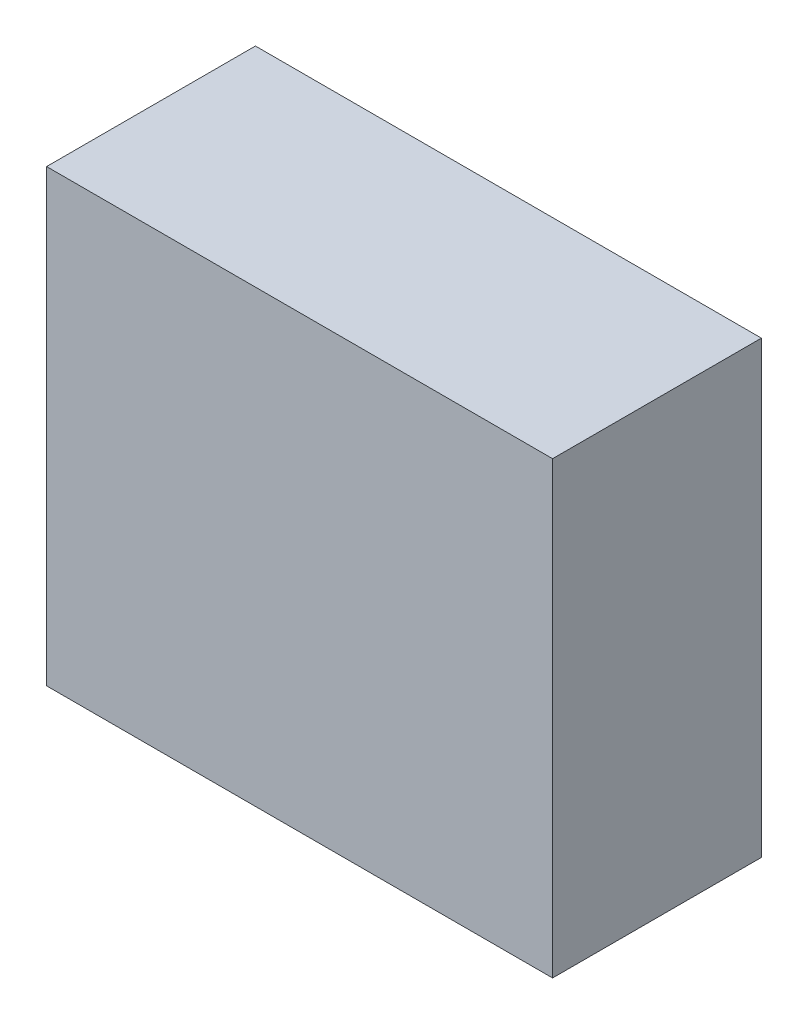
ISO-10303-21;
HEADER;
FILE_DESCRIPTION(('STEP AP214'),'2;1');
FILE_NAME('part.step','',(''),(''),'','','');
FILE_SCHEMA(('AUTOMOTIVE_DESIGN { 1 0 10303 214 1 1 1 1 }'));
ENDSEC;
DATA;
#1=APPLICATION_CONTEXT('core data for automotive mechanical design processes');
#2=APPLICATION_PROTOCOL_DEFINITION('international standard','automotive_design',2000,#1);
#3=PRODUCT_CONTEXT('',#1,'mechanical');
#4=PRODUCT('Part','Part','',(#3));
#5=PRODUCT_RELATED_PRODUCT_CATEGORY('part','',(#4));
#6=PRODUCT_DEFINITION_FORMATION('','',#4);
#7=PRODUCT_DEFINITION_CONTEXT('part definition',#1,'design');
#8=PRODUCT_DEFINITION('design','',#6,#7);
#9=PRODUCT_DEFINITION_SHAPE('','',#8);
#10=(LENGTH_UNIT() NAMED_UNIT(*) SI_UNIT(.MILLI.,.METRE.));
#11=(NAMED_UNIT(*) PLANE_ANGLE_UNIT() SI_UNIT($,.RADIAN.));
#12=(NAMED_UNIT(*) SI_UNIT($,.STERADIAN.) SOLID_ANGLE_UNIT());
#13=UNCERTAINTY_MEASURE_WITH_UNIT(LENGTH_MEASURE(1.E-05),#10,'distance_accuracy_value','');
#14=(GEOMETRIC_REPRESENTATION_CONTEXT(3) GLOBAL_UNCERTAINTY_ASSIGNED_CONTEXT((#13)) GLOBAL_UNIT_ASSIGNED_CONTEXT((#10,
#11,#12)) REPRESENTATION_CONTEXT('',''));
#15=CARTESIAN_POINT('',(0.,0.,0.));
#16=DIRECTION('',(0.,0.,1.));
#17=DIRECTION('',(1.,0.,0.));
#18=AXIS2_PLACEMENT_3D('',#15,#16,#17);
#19=CARTESIAN_POINT('',(-72.,-55.,236.5));
#20=DIRECTION('',(0.,0.,1.));
#21=DIRECTION('',(1.,0.,0.));
#22=AXIS2_PLACEMENT_3D('',#19,#20,#21);
#23=PLANE('',#22);
#24=DIRECTION('',(-1.,0.,0.));
#25=VECTOR('',#24,1.);
#26=CARTESIAN_POINT('',(-72.,-55.,236.5));
#27=LINE('',#26,#25);
#28=CARTESIAN_POINT('',(-72.,-55.,236.5));
#29=VERTEX_POINT('',#28);
#30=CARTESIAN_POINT('',(-198.,-55.,236.5));
#31=VERTEX_POINT('',#30);
#32=EDGE_CURVE('E70',#29,#31,#27,.T.);
#33=ORIENTED_EDGE('',*,*,#32,.F.);
#34=DIRECTION('',(0.,1.,0.));
#35=VECTOR('',#34,1.);
#36=CARTESIAN_POINT('',(-72.,-55.,236.5));
#37=LINE('',#36,#35);
#38=CARTESIAN_POINT('',(-72.,57.,236.5));
#39=VERTEX_POINT('',#38);
#40=EDGE_CURVE('E63',#29,#39,#37,.T.);
#41=ORIENTED_EDGE('',*,*,#40,.T.);
#42=DIRECTION('',(-1.,0.,0.));
#43=VECTOR('',#42,1.);
#44=CARTESIAN_POINT('',(-72.,57.,236.5));
#45=LINE('',#44,#43);
#46=CARTESIAN_POINT('',(-198.,57.,236.5));
#47=VERTEX_POINT('',#46);
#48=EDGE_CURVE('E72',#39,#47,#45,.T.);
#49=ORIENTED_EDGE('',*,*,#48,.T.);
#50=DIRECTION('',(0.,1.,0.));
#51=VECTOR('',#50,1.);
#52=CARTESIAN_POINT('',(-198.,-55.,236.5));
#53=LINE('',#52,#51);
#54=EDGE_CURVE('E10',#31,#47,#53,.T.);
#55=ORIENTED_EDGE('',*,*,#54,.F.);
#56=EDGE_LOOP('',(#33,#41,#49,#55));
#57=FACE_BOUND('',#56,.T.);
#58=ADVANCED_FACE('F15',(#57),#23,.T.);
#59=CARTESIAN_POINT('',(-72.,-55.,184.5));
#60=DIRECTION('',(0.,0.,1.));
#61=DIRECTION('',(1.,0.,0.));
#62=AXIS2_PLACEMENT_3D('',#59,#60,#61);
#63=PLANE('',#62);
#64=DIRECTION('',(0.,1.,0.));
#65=VECTOR('',#64,1.);
#66=CARTESIAN_POINT('',(-198.,-55.,184.5));
#67=LINE('',#66,#65);
#68=CARTESIAN_POINT('',(-198.,-55.,184.5));
#69=VERTEX_POINT('',#68);
#70=CARTESIAN_POINT('',(-198.,57.,184.5));
#71=VERTEX_POINT('',#70);
#72=EDGE_CURVE('E26',#69,#71,#67,.T.);
#73=ORIENTED_EDGE('',*,*,#72,.T.);
#74=DIRECTION('',(-1.,0.,0.));
#75=VECTOR('',#74,1.);
#76=CARTESIAN_POINT('',(-72.,57.,184.5));
#77=LINE('',#76,#75);
#78=CARTESIAN_POINT('',(-72.,57.,184.5));
#79=VERTEX_POINT('',#78);
#80=EDGE_CURVE('E88',#79,#71,#77,.T.);
#81=ORIENTED_EDGE('',*,*,#80,.F.);
#82=DIRECTION('',(0.,1.,0.));
#83=VECTOR('',#82,1.);
#84=CARTESIAN_POINT('',(-72.,-55.,184.5));
#85=LINE('',#84,#83);
#86=CARTESIAN_POINT('',(-72.,-55.,184.5));
#87=VERTEX_POINT('',#86);
#88=EDGE_CURVE('E94',#87,#79,#85,.T.);
#89=ORIENTED_EDGE('',*,*,#88,.F.);
#90=DIRECTION('',(-1.,0.,0.));
#91=VECTOR('',#90,1.);
#92=CARTESIAN_POINT('',(-72.,-55.,184.5));
#93=LINE('',#92,#91);
#94=EDGE_CURVE('E79',#87,#69,#93,.T.);
#95=ORIENTED_EDGE('',*,*,#94,.T.);
#96=EDGE_LOOP('',(#73,#81,#89,#95));
#97=FACE_BOUND('',#96,.T.);
#98=ADVANCED_FACE('F113',(#97),#63,.F.);
#99=CARTESIAN_POINT('',(-198.,-55.,184.5));
#100=DIRECTION('',(-1.,0.,0.));
#101=DIRECTION('',(0.,0.,1.));
#102=AXIS2_PLACEMENT_3D('',#99,#100,#101);
#103=PLANE('',#102);
#104=ORIENTED_EDGE('',*,*,#72,.F.);
#105=DIRECTION('',(0.,0.,1.));
#106=VECTOR('',#105,1.);
#107=CARTESIAN_POINT('',(-198.,-55.,184.5));
#108=LINE('',#107,#106);
#109=EDGE_CURVE('E19',#69,#31,#108,.T.);
#110=ORIENTED_EDGE('',*,*,#109,.T.);
#111=ORIENTED_EDGE('',*,*,#54,.T.);
#112=DIRECTION('',(0.,0.,1.));
#113=VECTOR('',#112,1.);
#114=CARTESIAN_POINT('',(-198.,57.,184.5));
#115=LINE('',#114,#113);
#116=EDGE_CURVE('E86',#71,#47,#115,.T.);
#117=ORIENTED_EDGE('',*,*,#116,.F.);
#118=EDGE_LOOP('',(#104,#110,#111,#117));
#119=FACE_BOUND('',#118,.T.);
#120=ADVANCED_FACE('F17',(#119),#103,.T.);
#121=CARTESIAN_POINT('',(-72.,-55.,184.5));
#122=DIRECTION('',(-1.,0.,0.));
#123=DIRECTION('',(0.,0.,1.));
#124=AXIS2_PLACEMENT_3D('',#121,#122,#123);
#125=PLANE('',#124);
#126=DIRECTION('',(0.,0.,1.));
#127=VECTOR('',#126,1.);
#128=CARTESIAN_POINT('',(-72.,57.,184.5));
#129=LINE('',#128,#127);
#130=EDGE_CURVE('E89',#79,#39,#129,.T.);
#131=ORIENTED_EDGE('',*,*,#130,.T.);
#132=ORIENTED_EDGE('',*,*,#40,.F.);
#133=DIRECTION('',(0.,0.,1.));
#134=VECTOR('',#133,1.);
#135=CARTESIAN_POINT('',(-72.,-55.,184.5));
#136=LINE('',#135,#134);
#137=EDGE_CURVE('E81',#87,#29,#136,.T.);
#138=ORIENTED_EDGE('',*,*,#137,.F.);
#139=ORIENTED_EDGE('',*,*,#88,.T.);
#140=EDGE_LOOP('',(#131,#132,#138,#139));
#141=FACE_BOUND('',#140,.T.);
#142=ADVANCED_FACE('F110',(#141),#125,.F.);
#143=CARTESIAN_POINT('',(-72.,57.,184.5));
#144=DIRECTION('',(0.,1.,0.));
#145=DIRECTION('',(1.,0.,0.));
#146=AXIS2_PLACEMENT_3D('',#143,#144,#145);
#147=PLANE('',#146);
#148=ORIENTED_EDGE('',*,*,#130,.F.);
#149=ORIENTED_EDGE('',*,*,#80,.T.);
#150=ORIENTED_EDGE('',*,*,#116,.T.);
#151=ORIENTED_EDGE('',*,*,#48,.F.);
#152=EDGE_LOOP('',(#148,#149,#150,#151));
#153=FACE_BOUND('',#152,.T.);
#154=ADVANCED_FACE('F115',(#153),#147,.T.);
#155=CARTESIAN_POINT('',(-72.,-55.,184.5));
#156=DIRECTION('',(0.,1.,0.));
#157=DIRECTION('',(1.,0.,0.));
#158=AXIS2_PLACEMENT_3D('',#155,#156,#157);
#159=PLANE('',#158);
#160=ORIENTED_EDGE('',*,*,#32,.T.);
#161=ORIENTED_EDGE('',*,*,#109,.F.);
#162=ORIENTED_EDGE('',*,*,#94,.F.);
#163=ORIENTED_EDGE('',*,*,#137,.T.);
#164=EDGE_LOOP('',(#160,#161,#162,#163));
#165=FACE_BOUND('',#164,.T.);
#166=ADVANCED_FACE('F80',(#165),#159,.F.);
#167=CLOSED_SHELL('',(#58,#98,#120,#142,#154,#166));
#168=MANIFOLD_SOLID_BREP('B1',#167);
#169=ADVANCED_BREP_SHAPE_REPRESENTATION('',(#18,#168),#14);
#170=SHAPE_DEFINITION_REPRESENTATION(#9,#169);
ENDSEC;
END-ISO-10303-21;
